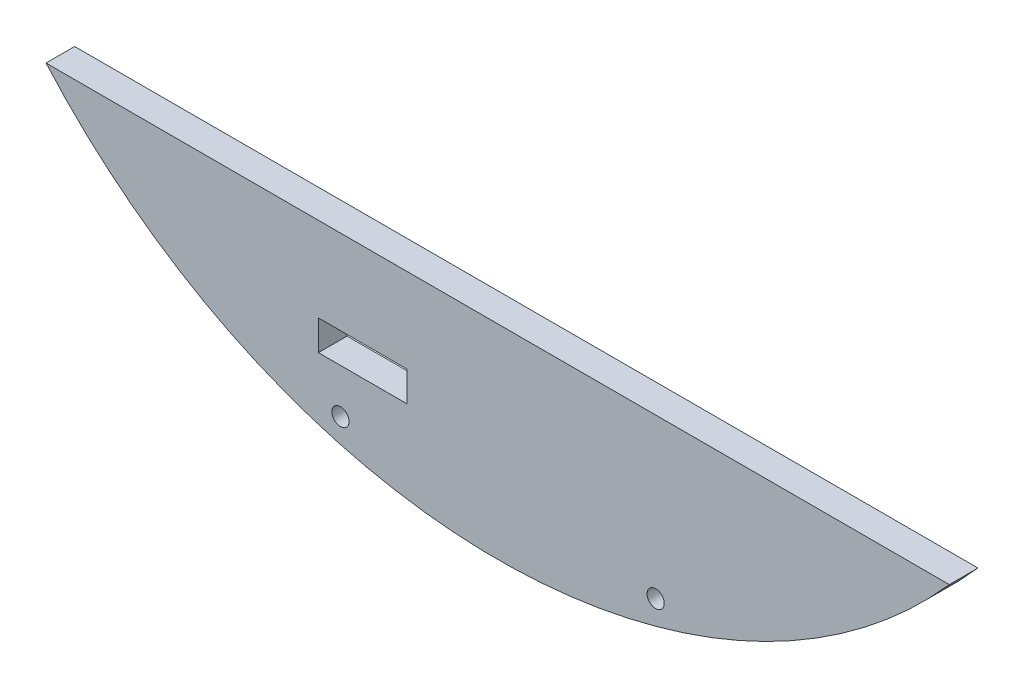
ISO-10303-21;
HEADER;
FILE_DESCRIPTION(('STEP AP214'),'2;1');
FILE_NAME('part.step','',(''),(''),'','','');
FILE_SCHEMA(('AUTOMOTIVE_DESIGN { 1 0 10303 214 1 1 1 1 }'));
ENDSEC;
DATA;
#1=APPLICATION_CONTEXT('core data for automotive mechanical design processes');
#2=APPLICATION_PROTOCOL_DEFINITION('international standard','automotive_design',2000,#1);
#3=PRODUCT_CONTEXT('',#1,'mechanical');
#4=PRODUCT('Part','Part','',(#3));
#5=PRODUCT_RELATED_PRODUCT_CATEGORY('part','',(#4));
#6=PRODUCT_DEFINITION_FORMATION('','',#4);
#7=PRODUCT_DEFINITION_CONTEXT('part definition',#1,'design');
#8=PRODUCT_DEFINITION('design','',#6,#7);
#9=PRODUCT_DEFINITION_SHAPE('','',#8);
#10=(LENGTH_UNIT() NAMED_UNIT(*) SI_UNIT(.MILLI.,.METRE.));
#11=(NAMED_UNIT(*) PLANE_ANGLE_UNIT() SI_UNIT($,.RADIAN.));
#12=(NAMED_UNIT(*) SI_UNIT($,.STERADIAN.) SOLID_ANGLE_UNIT());
#13=UNCERTAINTY_MEASURE_WITH_UNIT(LENGTH_MEASURE(1.E-05),#10,'distance_accuracy_value','');
#14=(GEOMETRIC_REPRESENTATION_CONTEXT(3) GLOBAL_UNCERTAINTY_ASSIGNED_CONTEXT((#13)) GLOBAL_UNIT_ASSIGNED_CONTEXT((#10,
#11,#12)) REPRESENTATION_CONTEXT('',''));
#15=CARTESIAN_POINT('',(0.,0.,0.));
#16=DIRECTION('',(0.,0.,1.));
#17=DIRECTION('',(1.,0.,0.));
#18=AXIS2_PLACEMENT_3D('',#15,#16,#17);
#19=CARTESIAN_POINT('',(0.154905530931429,-0.175561371529506,5.));
#20=DIRECTION('',(0.,0.,1.));
#21=DIRECTION('',(1.,0.,0.));
#22=AXIS2_PLACEMENT_3D('',#19,#20,#21);
#23=PLANE('',#22);
#24=CARTESIAN_POINT('',(-27.2791708894403,-97.3076156415731,5.));
#25=DIRECTION('',(0.,0.,1.));
#26=DIRECTION('',(1.,0.,0.));
#27=AXIS2_PLACEMENT_3D('',#24,#25,#26);
#28=CIRCLE('',#27,1.5);
#29=CARTESIAN_POINT('',(-25.7791708894403,-97.3076156415731,5.));
#30=VERTEX_POINT('',#29);
#31=EDGE_CURVE('E238',#30,#30,#28,.T.);
#32=ORIENTED_EDGE('',*,*,#31,.F.);
#33=EDGE_LOOP('',(#32));
#34=FACE_BOUND('',#33,.T.);
#35=CARTESIAN_POINT('',(27.7208291105598,-97.3076156415731,5.));
#36=DIRECTION('',(0.,0.,1.));
#37=DIRECTION('',(1.,0.,0.));
#38=AXIS2_PLACEMENT_3D('',#35,#36,#37);
#39=CIRCLE('',#38,1.5);
#40=CARTESIAN_POINT('',(29.2208291105598,-97.3076156415731,5.));
#41=VERTEX_POINT('',#40);
#42=EDGE_CURVE('E243',#41,#41,#39,.T.);
#43=ORIENTED_EDGE('',*,*,#42,.F.);
#44=EDGE_LOOP('',(#43));
#45=FACE_BOUND('',#44,.T.);
#46=CARTESIAN_POINT('',(0.154905530931429,-0.175561371529506,5.));
#47=DIRECTION('',(0.,0.,1.));
#48=DIRECTION('',(1.,0.,0.));
#49=AXIS2_PLACEMENT_3D('',#46,#47,#48);
#50=CIRCLE('',#49,105.);
#51=CARTESIAN_POINT('',(-78.6558205491443,-69.5576156415731,5.));
#52=VERTEX_POINT('',#51);
#53=CARTESIAN_POINT('',(78.9656316110072,-69.5576156415731,5.));
#54=VERTEX_POINT('',#53);
#55=EDGE_CURVE('E126',#52,#54,#50,.T.);
#56=ORIENTED_EDGE('',*,*,#55,.T.);
#57=DIRECTION('',(-1.,0.,0.));
#58=VECTOR('',#57,1.);
#59=CARTESIAN_POINT('',(78.9656316110072,-69.5576156415731,5.));
#60=LINE('',#59,#58);
#61=EDGE_CURVE('E129',#54,#52,#60,.T.);
#62=ORIENTED_EDGE('',*,*,#61,.T.);
#63=EDGE_LOOP('',(#56,#62));
#64=FACE_BOUND('',#63,.T.);
#65=DIRECTION('',(-1.,0.,0.));
#66=VECTOR('',#65,1.);
#67=CARTESIAN_POINT('',(-15.6266496597041,-84.3076156415731,5.));
#68=LINE('',#67,#66);
#69=CARTESIAN_POINT('',(-15.6266496597041,-84.3076156415731,5.));
#70=VERTEX_POINT('',#69);
#71=CARTESIAN_POINT('',(-31.1266496597041,-84.3076156415731,5.));
#72=VERTEX_POINT('',#71);
#73=EDGE_CURVE('E96',#70,#72,#68,.T.);
#74=ORIENTED_EDGE('',*,*,#73,.F.);
#75=DIRECTION('',(0.,1.,0.));
#76=VECTOR('',#75,1.);
#77=CARTESIAN_POINT('',(-15.6266496597041,-89.5576156415731,5.));
#78=LINE('',#77,#76);
#79=CARTESIAN_POINT('',(-15.6266496597041,-89.5576156415731,5.));
#80=VERTEX_POINT('',#79);
#81=EDGE_CURVE('E88',#80,#70,#78,.T.);
#82=ORIENTED_EDGE('',*,*,#81,.F.);
#83=DIRECTION('',(1.,0.,0.));
#84=VECTOR('',#83,1.);
#85=CARTESIAN_POINT('',(-15.6266496597041,-89.5576156415731,5.));
#86=LINE('',#85,#84);
#87=CARTESIAN_POINT('',(-31.1266496597041,-89.5576156415731,5.));
#88=VERTEX_POINT('',#87);
#89=EDGE_CURVE('E110',#88,#80,#86,.T.);
#90=ORIENTED_EDGE('',*,*,#89,.F.);
#91=DIRECTION('',(0.,-1.,0.));
#92=VECTOR('',#91,1.);
#93=CARTESIAN_POINT('',(-31.1266496597041,-89.5576156415731,5.));
#94=LINE('',#93,#92);
#95=EDGE_CURVE('E108',#72,#88,#94,.T.);
#96=ORIENTED_EDGE('',*,*,#95,.F.);
#97=EDGE_LOOP('',(#74,#82,#90,#96));
#98=FACE_BOUND('',#97,.T.);
#99=ADVANCED_FACE('F35',(#34,#45,#64,#98),#23,.T.);
#100=CARTESIAN_POINT('',(0.154905530931429,-0.175561371529506,0.));
#101=DIRECTION('',(0.,0.,1.));
#102=DIRECTION('',(1.,0.,0.));
#103=AXIS2_PLACEMENT_3D('',#100,#101,#102);
#104=PLANE('',#103);
#105=CARTESIAN_POINT('',(-27.2791708894403,-97.3076156415731,0.));
#106=DIRECTION('',(0.,0.,1.));
#107=DIRECTION('',(1.,0.,0.));
#108=AXIS2_PLACEMENT_3D('',#105,#106,#107);
#109=CIRCLE('',#108,1.5);
#110=CARTESIAN_POINT('',(-25.7791708894403,-97.3076156415731,0.));
#111=VERTEX_POINT('',#110);
#112=EDGE_CURVE('E116',#111,#111,#109,.T.);
#113=ORIENTED_EDGE('',*,*,#112,.T.);
#114=EDGE_LOOP('',(#113));
#115=FACE_BOUND('',#114,.T.);
#116=CARTESIAN_POINT('',(27.7208291105598,-97.3076156415731,0.));
#117=DIRECTION('',(0.,0.,1.));
#118=DIRECTION('',(1.,0.,0.));
#119=AXIS2_PLACEMENT_3D('',#116,#117,#118);
#120=CIRCLE('',#119,1.5);
#121=CARTESIAN_POINT('',(29.2208291105598,-97.3076156415731,0.));
#122=VERTEX_POINT('',#121);
#123=EDGE_CURVE('E239',#122,#122,#120,.T.);
#124=ORIENTED_EDGE('',*,*,#123,.T.);
#125=EDGE_LOOP('',(#124));
#126=FACE_BOUND('',#125,.T.);
#127=CARTESIAN_POINT('',(0.154905530931429,-0.175561371529506,0.));
#128=DIRECTION('',(0.,0.,1.));
#129=DIRECTION('',(1.,0.,0.));
#130=AXIS2_PLACEMENT_3D('',#127,#128,#129);
#131=CIRCLE('',#130,105.);
#132=CARTESIAN_POINT('',(-78.6558205491443,-69.5576156415731,0.));
#133=VERTEX_POINT('',#132);
#134=CARTESIAN_POINT('',(78.9656316110072,-69.5576156415731,0.));
#135=VERTEX_POINT('',#134);
#136=EDGE_CURVE('E104',#133,#135,#131,.T.);
#137=ORIENTED_EDGE('',*,*,#136,.F.);
#138=DIRECTION('',(-1.,0.,0.));
#139=VECTOR('',#138,1.);
#140=CARTESIAN_POINT('',(78.9656316110072,-69.5576156415731,0.));
#141=LINE('',#140,#139);
#142=EDGE_CURVE('E130',#135,#133,#141,.T.);
#143=ORIENTED_EDGE('',*,*,#142,.F.);
#144=EDGE_LOOP('',(#137,#143));
#145=FACE_BOUND('',#144,.T.);
#146=DIRECTION('',(0.,1.,0.));
#147=VECTOR('',#146,1.);
#148=CARTESIAN_POINT('',(-15.6266496597041,-89.5576156415731,0.));
#149=LINE('',#148,#147);
#150=CARTESIAN_POINT('',(-15.6266496597041,-89.5576156415731,0.));
#151=VERTEX_POINT('',#150);
#152=CARTESIAN_POINT('',(-15.6266496597041,-84.3076156415731,0.));
#153=VERTEX_POINT('',#152);
#154=EDGE_CURVE('E58',#151,#153,#149,.T.);
#155=ORIENTED_EDGE('',*,*,#154,.T.);
#156=DIRECTION('',(-1.,0.,0.));
#157=VECTOR('',#156,1.);
#158=CARTESIAN_POINT('',(-15.6266496597041,-84.3076156415731,0.));
#159=LINE('',#158,#157);
#160=CARTESIAN_POINT('',(-31.1266496597041,-84.3076156415731,0.));
#161=VERTEX_POINT('',#160);
#162=EDGE_CURVE('E103',#153,#161,#159,.T.);
#163=ORIENTED_EDGE('',*,*,#162,.T.);
#164=DIRECTION('',(0.,-1.,0.));
#165=VECTOR('',#164,1.);
#166=CARTESIAN_POINT('',(-31.1266496597041,-89.5576156415731,0.));
#167=LINE('',#166,#165);
#168=CARTESIAN_POINT('',(-31.1266496597041,-89.5576156415731,0.));
#169=VERTEX_POINT('',#168);
#170=EDGE_CURVE('E118',#161,#169,#167,.T.);
#171=ORIENTED_EDGE('',*,*,#170,.T.);
#172=DIRECTION('',(1.,0.,0.));
#173=VECTOR('',#172,1.);
#174=CARTESIAN_POINT('',(-15.6266496597041,-89.5576156415731,0.));
#175=LINE('',#174,#173);
#176=EDGE_CURVE('E97',#169,#151,#175,.T.);
#177=ORIENTED_EDGE('',*,*,#176,.T.);
#178=EDGE_LOOP('',(#155,#163,#171,#177));
#179=FACE_BOUND('',#178,.T.);
#180=ADVANCED_FACE('F142',(#115,#126,#145,#179),#104,.F.);
#181=CARTESIAN_POINT('',(0.154905530931429,-0.175561371529506,5.));
#182=DIRECTION('',(0.,0.,-1.));
#183=DIRECTION('',(-1.,0.,0.));
#184=AXIS2_PLACEMENT_3D('',#181,#182,#183);
#185=CYLINDRICAL_SURFACE('',#184,105.);
#186=ORIENTED_EDGE('',*,*,#136,.T.);
#187=DIRECTION('',(0.,0.,-1.));
#188=VECTOR('',#187,1.);
#189=CARTESIAN_POINT('',(78.9656316110072,-69.5576156415731,5.));
#190=LINE('',#189,#188);
#191=EDGE_CURVE('E11',#54,#135,#190,.T.);
#192=ORIENTED_EDGE('',*,*,#191,.F.);
#193=ORIENTED_EDGE('',*,*,#55,.F.);
#194=DIRECTION('',(0.,0.,-1.));
#195=VECTOR('',#194,1.);
#196=CARTESIAN_POINT('',(-78.6558205491443,-69.5576156415731,5.));
#197=LINE('',#196,#195);
#198=EDGE_CURVE('E43',#52,#133,#197,.T.);
#199=ORIENTED_EDGE('',*,*,#198,.T.);
#200=EDGE_LOOP('',(#186,#192,#193,#199));
#201=FACE_BOUND('',#200,.T.);
#202=ADVANCED_FACE('F37',(#201),#185,.T.);
#203=CARTESIAN_POINT('',(78.9656316110072,-69.5576156415731,5.));
#204=DIRECTION('',(0.,-1.,0.));
#205=DIRECTION('',(0.,0.,-1.));
#206=AXIS2_PLACEMENT_3D('',#203,#204,#205);
#207=PLANE('',#206);
#208=ORIENTED_EDGE('',*,*,#142,.T.);
#209=ORIENTED_EDGE('',*,*,#198,.F.);
#210=ORIENTED_EDGE('',*,*,#61,.F.);
#211=ORIENTED_EDGE('',*,*,#191,.T.);
#212=EDGE_LOOP('',(#208,#209,#210,#211));
#213=FACE_BOUND('',#212,.T.);
#214=ADVANCED_FACE('F144',(#213),#207,.F.);
#215=CARTESIAN_POINT('',(-15.6266496597041,-89.5576156415731,5.));
#216=DIRECTION('',(-1.,0.,0.));
#217=DIRECTION('',(0.,0.,1.));
#218=AXIS2_PLACEMENT_3D('',#215,#216,#217);
#219=PLANE('',#218);
#220=ORIENTED_EDGE('',*,*,#154,.F.);
#221=DIRECTION('',(0.,0.,-1.));
#222=VECTOR('',#221,1.);
#223=CARTESIAN_POINT('',(-15.6266496597041,-89.5576156415731,5.));
#224=LINE('',#223,#222);
#225=EDGE_CURVE('E92',#80,#151,#224,.T.);
#226=ORIENTED_EDGE('',*,*,#225,.F.);
#227=ORIENTED_EDGE('',*,*,#81,.T.);
#228=DIRECTION('',(0.,0.,-1.));
#229=VECTOR('',#228,1.);
#230=CARTESIAN_POINT('',(-15.6266496597041,-84.3076156415731,5.));
#231=LINE('',#230,#229);
#232=EDGE_CURVE('E91',#70,#153,#231,.T.);
#233=ORIENTED_EDGE('',*,*,#232,.T.);
#234=EDGE_LOOP('',(#220,#226,#227,#233));
#235=FACE_BOUND('',#234,.T.);
#236=ADVANCED_FACE('F90',(#235),#219,.T.);
#237=CARTESIAN_POINT('',(-15.6266496597041,-84.3076156415731,5.));
#238=DIRECTION('',(0.,-1.,0.));
#239=DIRECTION('',(0.,0.,-1.));
#240=AXIS2_PLACEMENT_3D('',#237,#238,#239);
#241=PLANE('',#240);
#242=ORIENTED_EDGE('',*,*,#162,.F.);
#243=ORIENTED_EDGE('',*,*,#232,.F.);
#244=ORIENTED_EDGE('',*,*,#73,.T.);
#245=DIRECTION('',(0.,0.,-1.));
#246=VECTOR('',#245,1.);
#247=CARTESIAN_POINT('',(-31.1266496597041,-84.3076156415731,5.));
#248=LINE('',#247,#246);
#249=EDGE_CURVE('E105',#72,#161,#248,.T.);
#250=ORIENTED_EDGE('',*,*,#249,.T.);
#251=EDGE_LOOP('',(#242,#243,#244,#250));
#252=FACE_BOUND('',#251,.T.);
#253=ADVANCED_FACE('F100',(#252),#241,.T.);
#254=CARTESIAN_POINT('',(-31.1266496597041,-89.5576156415731,5.));
#255=DIRECTION('',(1.,0.,0.));
#256=DIRECTION('',(0.,0.,-1.));
#257=AXIS2_PLACEMENT_3D('',#254,#255,#256);
#258=PLANE('',#257);
#259=ORIENTED_EDGE('',*,*,#170,.F.);
#260=ORIENTED_EDGE('',*,*,#249,.F.);
#261=ORIENTED_EDGE('',*,*,#95,.T.);
#262=DIRECTION('',(0.,0.,-1.));
#263=VECTOR('',#262,1.);
#264=CARTESIAN_POINT('',(-31.1266496597041,-89.5576156415731,5.));
#265=LINE('',#264,#263);
#266=EDGE_CURVE('E50',#88,#169,#265,.T.);
#267=ORIENTED_EDGE('',*,*,#266,.T.);
#268=EDGE_LOOP('',(#259,#260,#261,#267));
#269=FACE_BOUND('',#268,.T.);
#270=ADVANCED_FACE('F203',(#269),#258,.T.);
#271=CARTESIAN_POINT('',(-15.6266496597041,-89.5576156415731,5.));
#272=DIRECTION('',(0.,1.,0.));
#273=DIRECTION('',(0.,0.,1.));
#274=AXIS2_PLACEMENT_3D('',#271,#272,#273);
#275=PLANE('',#274);
#276=ORIENTED_EDGE('',*,*,#176,.F.);
#277=ORIENTED_EDGE('',*,*,#266,.F.);
#278=ORIENTED_EDGE('',*,*,#89,.T.);
#279=ORIENTED_EDGE('',*,*,#225,.T.);
#280=EDGE_LOOP('',(#276,#277,#278,#279));
#281=FACE_BOUND('',#280,.T.);
#282=ADVANCED_FACE('F183',(#281),#275,.T.);
#283=CARTESIAN_POINT('',(27.7208291105598,-97.3076156415731,0.));
#284=DIRECTION('',(0.,0.,1.));
#285=DIRECTION('',(1.,0.,0.));
#286=AXIS2_PLACEMENT_3D('',#283,#284,#285);
#287=CYLINDRICAL_SURFACE('',#286,1.5);
#288=ORIENTED_EDGE('',*,*,#123,.F.);
#289=EDGE_LOOP('',(#288));
#290=FACE_BOUND('',#289,.T.);
#291=ORIENTED_EDGE('',*,*,#42,.T.);
#292=EDGE_LOOP('',(#291));
#293=FACE_BOUND('',#292,.T.);
#294=ADVANCED_FACE('F177',(#290,#293),#287,.F.);
#295=CARTESIAN_POINT('',(-27.2791708894403,-97.3076156415731,0.));
#296=DIRECTION('',(0.,0.,1.));
#297=DIRECTION('',(1.,0.,0.));
#298=AXIS2_PLACEMENT_3D('',#295,#296,#297);
#299=CYLINDRICAL_SURFACE('',#298,1.5);
#300=ORIENTED_EDGE('',*,*,#112,.F.);
#301=EDGE_LOOP('',(#300));
#302=FACE_BOUND('',#301,.T.);
#303=ORIENTED_EDGE('',*,*,#31,.T.);
#304=EDGE_LOOP('',(#303));
#305=FACE_BOUND('',#304,.T.);
#306=ADVANCED_FACE('F182',(#302,#305),#299,.F.);
#307=CLOSED_SHELL('',(#99,#180,#202,#214,#236,#253,#270,#282,#294,#306));
#308=MANIFOLD_SOLID_BREP('B2',#307);
#309=ADVANCED_BREP_SHAPE_REPRESENTATION('',(#18,#308),#14);
#310=SHAPE_DEFINITION_REPRESENTATION(#9,#309);
ENDSEC;
END-ISO-10303-21;
